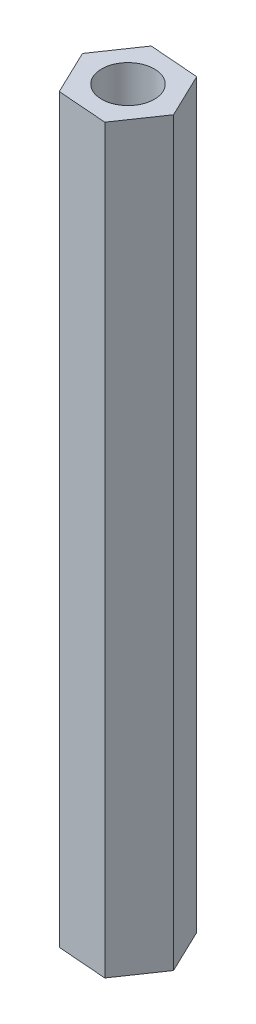
ISO-10303-21;
HEADER;
FILE_DESCRIPTION(('STEP AP214'),'2;1');
FILE_NAME('part.step','',(''),(''),'','','');
FILE_SCHEMA(('AUTOMOTIVE_DESIGN { 1 0 10303 214 1 1 1 1 }'));
ENDSEC;
DATA;
#1=APPLICATION_CONTEXT('core data for automotive mechanical design processes');
#2=APPLICATION_PROTOCOL_DEFINITION('international standard','automotive_design',2000,#1);
#3=PRODUCT_CONTEXT('',#1,'mechanical');
#4=PRODUCT('Part','Part','',(#3));
#5=PRODUCT_RELATED_PRODUCT_CATEGORY('part','',(#4));
#6=PRODUCT_DEFINITION_FORMATION('','',#4);
#7=PRODUCT_DEFINITION_CONTEXT('part definition',#1,'design');
#8=PRODUCT_DEFINITION('design','',#6,#7);
#9=PRODUCT_DEFINITION_SHAPE('','',#8);
#10=(LENGTH_UNIT() NAMED_UNIT(*) SI_UNIT(.MILLI.,.METRE.));
#11=(NAMED_UNIT(*) PLANE_ANGLE_UNIT() SI_UNIT($,.RADIAN.));
#12=(NAMED_UNIT(*) SI_UNIT($,.STERADIAN.) SOLID_ANGLE_UNIT());
#13=UNCERTAINTY_MEASURE_WITH_UNIT(LENGTH_MEASURE(1.E-05),#10,'distance_accuracy_value','');
#14=(GEOMETRIC_REPRESENTATION_CONTEXT(3) GLOBAL_UNCERTAINTY_ASSIGNED_CONTEXT((#13)) GLOBAL_UNIT_ASSIGNED_CONTEXT((#10,
#11,#12)) REPRESENTATION_CONTEXT('',''));
#15=CARTESIAN_POINT('',(0.,0.,0.));
#16=DIRECTION('',(0.,0.,1.));
#17=DIRECTION('',(1.,0.,0.));
#18=AXIS2_PLACEMENT_3D('',#15,#16,#17);
#19=CARTESIAN_POINT('',(0.,45.,0.));
#20=DIRECTION('',(0.,1.,0.));
#21=DIRECTION('',(0.,0.,1.));
#22=AXIS2_PLACEMENT_3D('',#19,#20,#21);
#23=PLANE('',#22);
#24=DIRECTION('',(0.997087277509707,0.,0.0762690043745235));
#25=VECTOR('',#24,1.);
#26=CARTESIAN_POINT('',(-1.69503779237079,45.,2.47793870298845));
#27=LINE('',#26,#25);
#28=CARTESIAN_POINT('',(-1.69503779237079,45.,2.47793870298845));
#29=VERTEX_POINT('',#28);
#30=CARTESIAN_POINT('',(1.29843896962327,45.,2.70691514006202));
#31=VERTEX_POINT('',#30);
#32=EDGE_CURVE('E143',#29,#31,#27,.T.);
#33=ORIENTED_EDGE('',*,*,#32,.T.);
#34=DIRECTION('',(0.564594534064537,0.,-0.825368409926409));
#35=VECTOR('',#34,1.);
#36=CARTESIAN_POINT('',(1.29843896962327,45.,2.70691514006202));
#37=LINE('',#36,#35);
#38=CARTESIAN_POINT('',(2.99347676199406,45.,0.22897643707357));
#39=VERTEX_POINT('',#38);
#40=EDGE_CURVE('E101',#31,#39,#37,.T.);
#41=ORIENTED_EDGE('',*,*,#40,.T.);
#42=DIRECTION('',(-0.43249274344517,0.,-0.901637414300932));
#43=VECTOR('',#42,1.);
#44=CARTESIAN_POINT('',(2.99347676199406,45.,0.22897643707357));
#45=LINE('',#44,#43);
#46=CARTESIAN_POINT('',(1.69503779237079,45.,-2.47793870298845));
#47=VERTEX_POINT('',#46);
#48=EDGE_CURVE('E114',#39,#47,#45,.T.);
#49=ORIENTED_EDGE('',*,*,#48,.T.);
#50=DIRECTION('',(-0.997087277509707,0.,-0.0762690043745234));
#51=VECTOR('',#50,1.);
#52=CARTESIAN_POINT('',(1.69503779237079,45.,-2.47793870298845));
#53=LINE('',#52,#51);
#54=CARTESIAN_POINT('',(-1.29843896962327,45.,-2.70691514006202));
#55=VERTEX_POINT('',#54);
#56=EDGE_CURVE('E108',#47,#55,#53,.T.);
#57=ORIENTED_EDGE('',*,*,#56,.T.);
#58=DIRECTION('',(-0.564594534064537,0.,0.825368409926409));
#59=VECTOR('',#58,1.);
#60=CARTESIAN_POINT('',(-1.29843896962327,45.,-2.70691514006202));
#61=LINE('',#60,#59);
#62=CARTESIAN_POINT('',(-2.99347676199406,45.,-0.228976437073569));
#63=VERTEX_POINT('',#62);
#64=EDGE_CURVE('E112',#55,#63,#61,.T.);
#65=ORIENTED_EDGE('',*,*,#64,.T.);
#66=DIRECTION('',(0.43249274344517,0.,0.901637414300932));
#67=VECTOR('',#66,1.);
#68=CARTESIAN_POINT('',(-2.99347676199406,45.,-0.228976437073569));
#69=LINE('',#68,#67);
#70=EDGE_CURVE('E64',#63,#29,#69,.T.);
#71=ORIENTED_EDGE('',*,*,#70,.T.);
#72=EDGE_LOOP('',(#33,#41,#49,#57,#65,#71));
#73=FACE_BOUND('',#72,.T.);
#74=CARTESIAN_POINT('',(0.,45.,0.));
#75=DIRECTION('',(0.,1.,0.));
#76=DIRECTION('',(0.,0.,1.));
#77=AXIS2_PLACEMENT_3D('',#74,#75,#76);
#78=CIRCLE('',#77,1.6);
#79=CARTESIAN_POINT('',(0.,45.,-1.6));
#80=VERTEX_POINT('',#79);
#81=EDGE_CURVE('E136',#80,#80,#78,.T.);
#82=ORIENTED_EDGE('',*,*,#81,.F.);
#83=EDGE_LOOP('',(#82));
#84=FACE_BOUND('',#83,.T.);
#85=ADVANCED_FACE('F47',(#73,#84),#23,.T.);
#86=CARTESIAN_POINT('',(0.,0.,0.));
#87=DIRECTION('',(0.,1.,0.));
#88=DIRECTION('',(0.,0.,1.));
#89=AXIS2_PLACEMENT_3D('',#86,#87,#88);
#90=PLANE('',#89);
#91=DIRECTION('',(0.997087277509707,0.,0.0762690043745235));
#92=VECTOR('',#91,1.);
#93=CARTESIAN_POINT('',(-1.69503779237079,0.,2.47793870298845));
#94=LINE('',#93,#92);
#95=CARTESIAN_POINT('',(-1.69503779237079,0.,2.47793870298845));
#96=VERTEX_POINT('',#95);
#97=CARTESIAN_POINT('',(1.29843896962327,0.,2.70691514006202));
#98=VERTEX_POINT('',#97);
#99=EDGE_CURVE('E132',#96,#98,#94,.T.);
#100=ORIENTED_EDGE('',*,*,#99,.F.);
#101=DIRECTION('',(0.43249274344517,0.,0.901637414300932));
#102=VECTOR('',#101,1.);
#103=CARTESIAN_POINT('',(-2.99347676199406,0.,-0.228976437073569));
#104=LINE('',#103,#102);
#105=CARTESIAN_POINT('',(-2.99347676199406,0.,-0.228976437073569));
#106=VERTEX_POINT('',#105);
#107=EDGE_CURVE('E93',#106,#96,#104,.T.);
#108=ORIENTED_EDGE('',*,*,#107,.F.);
#109=DIRECTION('',(-0.564594534064537,0.,0.825368409926409));
#110=VECTOR('',#109,1.);
#111=CARTESIAN_POINT('',(-1.29843896962327,0.,-2.70691514006202));
#112=LINE('',#111,#110);
#113=CARTESIAN_POINT('',(-1.29843896962327,0.,-2.70691514006202));
#114=VERTEX_POINT('',#113);
#115=EDGE_CURVE('E87',#114,#106,#112,.T.);
#116=ORIENTED_EDGE('',*,*,#115,.F.);
#117=DIRECTION('',(-0.997087277509707,0.,-0.0762690043745234));
#118=VECTOR('',#117,1.);
#119=CARTESIAN_POINT('',(1.69503779237079,0.,-2.47793870298845));
#120=LINE('',#119,#118);
#121=CARTESIAN_POINT('',(1.69503779237079,0.,-2.47793870298845));
#122=VERTEX_POINT('',#121);
#123=EDGE_CURVE('E122',#122,#114,#120,.T.);
#124=ORIENTED_EDGE('',*,*,#123,.F.);
#125=DIRECTION('',(-0.43249274344517,0.,-0.901637414300932));
#126=VECTOR('',#125,1.);
#127=CARTESIAN_POINT('',(2.99347676199406,0.,0.22897643707357));
#128=LINE('',#127,#126);
#129=CARTESIAN_POINT('',(2.99347676199406,0.,0.22897643707357));
#130=VERTEX_POINT('',#129);
#131=EDGE_CURVE('E138',#130,#122,#128,.T.);
#132=ORIENTED_EDGE('',*,*,#131,.F.);
#133=DIRECTION('',(0.564594534064537,0.,-0.825368409926409));
#134=VECTOR('',#133,1.);
#135=CARTESIAN_POINT('',(1.29843896962327,0.,2.70691514006202));
#136=LINE('',#135,#134);
#137=EDGE_CURVE('E135',#98,#130,#136,.T.);
#138=ORIENTED_EDGE('',*,*,#137,.F.);
#139=EDGE_LOOP('',(#100,#108,#116,#124,#132,#138));
#140=FACE_BOUND('',#139,.T.);
#141=CARTESIAN_POINT('',(0.,0.,0.));
#142=DIRECTION('',(0.,1.,0.));
#143=DIRECTION('',(0.,0.,1.));
#144=AXIS2_PLACEMENT_3D('',#141,#142,#143);
#145=CIRCLE('',#144,1.6);
#146=CARTESIAN_POINT('',(0.,0.,-1.6));
#147=VERTEX_POINT('',#146);
#148=EDGE_CURVE('E242',#147,#147,#145,.T.);
#149=ORIENTED_EDGE('',*,*,#148,.T.);
#150=EDGE_LOOP('',(#149));
#151=FACE_BOUND('',#150,.T.);
#152=ADVANCED_FACE('F152',(#140,#151),#90,.F.);
#153=CARTESIAN_POINT('',(-1.69503779237079,45.,2.47793870298845));
#154=DIRECTION('',(0.0762690043745235,0.,-0.997087277509707));
#155=DIRECTION('',(-0.997087277509707,0.,-0.0762690043745235));
#156=AXIS2_PLACEMENT_3D('',#153,#154,#155);
#157=PLANE('',#156);
#158=ORIENTED_EDGE('',*,*,#99,.T.);
#159=DIRECTION('',(0.,-1.,0.));
#160=VECTOR('',#159,1.);
#161=CARTESIAN_POINT('',(1.29843896962327,45.,2.70691514006202));
#162=LINE('',#161,#160);
#163=EDGE_CURVE('E11',#31,#98,#162,.T.);
#164=ORIENTED_EDGE('',*,*,#163,.F.);
#165=ORIENTED_EDGE('',*,*,#32,.F.);
#166=DIRECTION('',(0.,-1.,0.));
#167=VECTOR('',#166,1.);
#168=CARTESIAN_POINT('',(-1.69503779237079,45.,2.47793870298845));
#169=LINE('',#168,#167);
#170=EDGE_CURVE('E128',#29,#96,#169,.T.);
#171=ORIENTED_EDGE('',*,*,#170,.T.);
#172=EDGE_LOOP('',(#158,#164,#165,#171));
#173=FACE_BOUND('',#172,.T.);
#174=ADVANCED_FACE('F49',(#173),#157,.F.);
#175=CARTESIAN_POINT('',(1.29843896962327,45.,2.70691514006202));
#176=DIRECTION('',(-0.825368409926409,0.,-0.564594534064537));
#177=DIRECTION('',(-0.564594534064537,0.,0.825368409926409));
#178=AXIS2_PLACEMENT_3D('',#175,#176,#177);
#179=PLANE('',#178);
#180=ORIENTED_EDGE('',*,*,#137,.T.);
#181=DIRECTION('',(0.,-1.,0.));
#182=VECTOR('',#181,1.);
#183=CARTESIAN_POINT('',(2.99347676199406,45.,0.22897643707357));
#184=LINE('',#183,#182);
#185=EDGE_CURVE('E56',#39,#130,#184,.T.);
#186=ORIENTED_EDGE('',*,*,#185,.F.);
#187=ORIENTED_EDGE('',*,*,#40,.F.);
#188=ORIENTED_EDGE('',*,*,#163,.T.);
#189=EDGE_LOOP('',(#180,#186,#187,#188));
#190=FACE_BOUND('',#189,.T.);
#191=ADVANCED_FACE('F177',(#190),#179,.F.);
#192=CARTESIAN_POINT('',(2.99347676199406,45.,0.22897643707357));
#193=DIRECTION('',(-0.901637414300932,0.,0.43249274344517));
#194=DIRECTION('',(0.43249274344517,0.,0.901637414300932));
#195=AXIS2_PLACEMENT_3D('',#192,#193,#194);
#196=PLANE('',#195);
#197=ORIENTED_EDGE('',*,*,#131,.T.);
#198=DIRECTION('',(0.,-1.,0.));
#199=VECTOR('',#198,1.);
#200=CARTESIAN_POINT('',(1.69503779237079,45.,-2.47793870298845));
#201=LINE('',#200,#199);
#202=EDGE_CURVE('E123',#47,#122,#201,.T.);
#203=ORIENTED_EDGE('',*,*,#202,.F.);
#204=ORIENTED_EDGE('',*,*,#48,.F.);
#205=ORIENTED_EDGE('',*,*,#185,.T.);
#206=EDGE_LOOP('',(#197,#203,#204,#205));
#207=FACE_BOUND('',#206,.T.);
#208=ADVANCED_FACE('F149',(#207),#196,.F.);
#209=CARTESIAN_POINT('',(1.69503779237079,45.,-2.47793870298845));
#210=DIRECTION('',(-0.0762690043745234,0.,0.997087277509707));
#211=DIRECTION('',(0.997087277509707,0.,0.0762690043745234));
#212=AXIS2_PLACEMENT_3D('',#209,#210,#211);
#213=PLANE('',#212);
#214=ORIENTED_EDGE('',*,*,#123,.T.);
#215=DIRECTION('',(0.,-1.,0.));
#216=VECTOR('',#215,1.);
#217=CARTESIAN_POINT('',(-1.29843896962327,45.,-2.70691514006202));
#218=LINE('',#217,#216);
#219=EDGE_CURVE('E119',#55,#114,#218,.T.);
#220=ORIENTED_EDGE('',*,*,#219,.F.);
#221=ORIENTED_EDGE('',*,*,#56,.F.);
#222=ORIENTED_EDGE('',*,*,#202,.T.);
#223=EDGE_LOOP('',(#214,#220,#221,#222));
#224=FACE_BOUND('',#223,.T.);
#225=ADVANCED_FACE('F120',(#224),#213,.F.);
#226=CARTESIAN_POINT('',(-1.29843896962327,45.,-2.70691514006202));
#227=DIRECTION('',(0.825368409926409,0.,0.564594534064537));
#228=DIRECTION('',(0.564594534064537,0.,-0.825368409926409));
#229=AXIS2_PLACEMENT_3D('',#226,#227,#228);
#230=PLANE('',#229);
#231=ORIENTED_EDGE('',*,*,#115,.T.);
#232=DIRECTION('',(0.,-1.,0.));
#233=VECTOR('',#232,1.);
#234=CARTESIAN_POINT('',(-2.99347676199406,45.,-0.228976437073569));
#235=LINE('',#234,#233);
#236=EDGE_CURVE('E124',#63,#106,#235,.T.);
#237=ORIENTED_EDGE('',*,*,#236,.F.);
#238=ORIENTED_EDGE('',*,*,#64,.F.);
#239=ORIENTED_EDGE('',*,*,#219,.T.);
#240=EDGE_LOOP('',(#231,#237,#238,#239));
#241=FACE_BOUND('',#240,.T.);
#242=ADVANCED_FACE('F126',(#241),#230,.F.);
#243=CARTESIAN_POINT('',(-2.99347676199406,45.,-0.228976437073569));
#244=DIRECTION('',(0.901637414300932,0.,-0.43249274344517));
#245=DIRECTION('',(-0.43249274344517,0.,-0.901637414300932));
#246=AXIS2_PLACEMENT_3D('',#243,#244,#245);
#247=PLANE('',#246);
#248=ORIENTED_EDGE('',*,*,#107,.T.);
#249=ORIENTED_EDGE('',*,*,#170,.F.);
#250=ORIENTED_EDGE('',*,*,#70,.F.);
#251=ORIENTED_EDGE('',*,*,#236,.T.);
#252=EDGE_LOOP('',(#248,#249,#250,#251));
#253=FACE_BOUND('',#252,.T.);
#254=ADVANCED_FACE('F157',(#253),#247,.F.);
#255=CARTESIAN_POINT('',(0.,45.,0.));
#256=DIRECTION('',(0.,-1.,0.));
#257=DIRECTION('',(0.,0.,-1.));
#258=AXIS2_PLACEMENT_3D('',#255,#256,#257);
#259=CYLINDRICAL_SURFACE('',#258,1.6);
#260=CARTESIAN_POINT('',(0.,45.,-1.6));
#261=CARTESIAN_POINT('',(0.,44.53125,-1.6));
#262=CARTESIAN_POINT('',(0.,44.0625,-1.6));
#263=CARTESIAN_POINT('',(0.,43.125,-1.6));
#264=CARTESIAN_POINT('',(0.,42.65625,-1.6));
#265=CARTESIAN_POINT('',(0.,41.71875,-1.6));
#266=CARTESIAN_POINT('',(0.,41.25,-1.6));
#267=CARTESIAN_POINT('',(0.,40.3125,-1.6));
#268=CARTESIAN_POINT('',(0.,39.84375,-1.6));
#269=CARTESIAN_POINT('',(0.,38.90625,-1.6));
#270=CARTESIAN_POINT('',(0.,38.4375,-1.6));
#271=CARTESIAN_POINT('',(0.,37.5,-1.6));
#272=CARTESIAN_POINT('',(0.,37.03125,-1.6));
#273=CARTESIAN_POINT('',(0.,36.09375,-1.6));
#274=CARTESIAN_POINT('',(0.,35.625,-1.6));
#275=CARTESIAN_POINT('',(0.,34.6875,-1.6));
#276=CARTESIAN_POINT('',(0.,34.21875,-1.6));
#277=CARTESIAN_POINT('',(0.,33.28125,-1.6));
#278=CARTESIAN_POINT('',(0.,32.8125,-1.6));
#279=CARTESIAN_POINT('',(0.,31.875,-1.6));
#280=CARTESIAN_POINT('',(0.,31.40625,-1.6));
#281=CARTESIAN_POINT('',(0.,30.46875,-1.6));
#282=CARTESIAN_POINT('',(0.,30.,-1.6));
#283=CARTESIAN_POINT('',(0.,29.0625,-1.6));
#284=CARTESIAN_POINT('',(0.,28.59375,-1.6));
#285=CARTESIAN_POINT('',(0.,27.65625,-1.6));
#286=CARTESIAN_POINT('',(0.,27.1875,-1.6));
#287=CARTESIAN_POINT('',(0.,26.25,-1.6));
#288=CARTESIAN_POINT('',(0.,25.78125,-1.6));
#289=CARTESIAN_POINT('',(0.,24.84375,-1.6));
#290=CARTESIAN_POINT('',(0.,24.375,-1.6));
#291=CARTESIAN_POINT('',(0.,23.4375,-1.6));
#292=CARTESIAN_POINT('',(0.,22.96875,-1.6));
#293=CARTESIAN_POINT('',(0.,22.03125,-1.6));
#294=CARTESIAN_POINT('',(0.,21.5625,-1.6));
#295=CARTESIAN_POINT('',(0.,20.625,-1.6));
#296=CARTESIAN_POINT('',(0.,20.15625,-1.6));
#297=CARTESIAN_POINT('',(0.,19.21875,-1.6));
#298=CARTESIAN_POINT('',(0.,18.75,-1.6));
#299=CARTESIAN_POINT('',(0.,17.8125,-1.6));
#300=CARTESIAN_POINT('',(0.,17.34375,-1.6));
#301=CARTESIAN_POINT('',(0.,16.40625,-1.6));
#302=CARTESIAN_POINT('',(0.,15.9375,-1.6));
#303=CARTESIAN_POINT('',(0.,15.,-1.6));
#304=CARTESIAN_POINT('',(0.,14.53125,-1.6));
#305=CARTESIAN_POINT('',(0.,13.59375,-1.6));
#306=CARTESIAN_POINT('',(0.,13.125,-1.6));
#307=CARTESIAN_POINT('',(0.,12.1875,-1.6));
#308=CARTESIAN_POINT('',(0.,11.71875,-1.6));
#309=CARTESIAN_POINT('',(0.,10.78125,-1.6));
#310=CARTESIAN_POINT('',(0.,10.3125,-1.6));
#311=CARTESIAN_POINT('',(0.,9.375,-1.6));
#312=CARTESIAN_POINT('',(0.,8.90625,-1.6));
#313=CARTESIAN_POINT('',(0.,7.96874999999999,-1.6));
#314=CARTESIAN_POINT('',(0.,7.5,-1.6));
#315=CARTESIAN_POINT('',(0.,6.5625,-1.6));
#316=CARTESIAN_POINT('',(0.,6.09375,-1.6));
#317=CARTESIAN_POINT('',(0.,5.15625,-1.6));
#318=CARTESIAN_POINT('',(0.,4.68749999999999,-1.6));
#319=CARTESIAN_POINT('',(0.,3.74999999999999,-1.6));
#320=CARTESIAN_POINT('',(0.,3.28124999999999,-1.6));
#321=CARTESIAN_POINT('',(0.,2.34374999999999,-1.6));
#322=CARTESIAN_POINT('',(0.,1.87499999999999,-1.6));
#323=CARTESIAN_POINT('',(0.,0.937499999999992,-1.6));
#324=CARTESIAN_POINT('',(0.,0.468749999999993,-1.6));
#325=CARTESIAN_POINT('',(0.,0.,-1.6));
#326=B_SPLINE_CURVE_WITH_KNOTS('',3,(#260,#261,#262,#263,#264,#265,#266,#267,#268,#269,#270,
#271,#272,#273,#274,#275,#276,#277,#278,#279,#280,#281,#282,#283,#284,#285,#286,#287,#288,#289,
#290,#291,#292,#293,#294,#295,#296,#297,#298,#299,#300,#301,#302,#303,#304,#305,#306,#307,#308,
#309,#310,#311,#312,#313,#314,#315,#316,#317,#318,#319,#320,#321,#322,#323,#324,#325),
.UNSPECIFIED.,.F.,.F.,(4,2,2,2,2,2,2,2,2,2,2,2,2,2,2,2,2,2,2,2,2,2,2,2,2,2,2,2,2,2,2,2,4),(0.,
1.40625,2.8125,4.21875000000001,5.62500000000001,7.03125,8.4375,9.84375000000001,11.25,12.65625,
14.0625,15.46875,16.875,18.28125,19.6875,21.09375,22.5,23.90625,25.3125,26.71875,28.125,
29.53125,30.9375,32.34375,33.75,35.15625,36.5625,37.96875,39.375,40.78125,42.1875,43.59375,45.),.UNSPECIFIED.);
#327=EDGE_CURVE('BSEAM159',#80,#147,#326,.T.);
#328=ORIENTED_EDGE('',*,*,#81,.T.);
#329=ORIENTED_EDGE('',*,*,#148,.F.);
#330=ORIENTED_EDGE('',*,*,#327,.T.);
#331=ORIENTED_EDGE('',*,*,#327,.F.);
#332=EDGE_LOOP('',(#328,#330,#329,#331));
#333=FACE_BOUND('',#332,.T.);
#334=ADVANCED_FACE('F159',(#333),#259,.F.);
#335=CLOSED_SHELL('',(#85,#152,#174,#191,#208,#225,#242,#254,#334));
#336=MANIFOLD_SOLID_BREP('B2',#335);
#337=ADVANCED_BREP_SHAPE_REPRESENTATION('',(#18,#336),#14);
#338=SHAPE_DEFINITION_REPRESENTATION(#9,#337);
ENDSEC;
END-ISO-10303-21;
